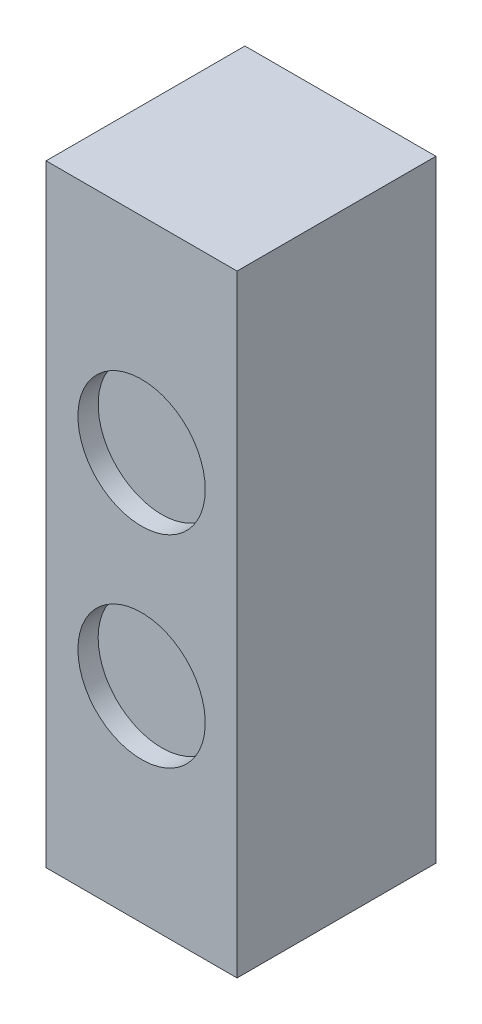
ISO-10303-21;
HEADER;
FILE_DESCRIPTION(('STEP AP214'),'2;1');
FILE_NAME('part.step','',(''),(''),'','','');
FILE_SCHEMA(('AUTOMOTIVE_DESIGN { 1 0 10303 214 1 1 1 1 }'));
ENDSEC;
DATA;
#1=APPLICATION_CONTEXT('core data for automotive mechanical design processes');
#2=APPLICATION_PROTOCOL_DEFINITION('international standard','automotive_design',2000,#1);
#3=PRODUCT_CONTEXT('',#1,'mechanical');
#4=PRODUCT('Part','Part','',(#3));
#5=PRODUCT_RELATED_PRODUCT_CATEGORY('part','',(#4));
#6=PRODUCT_DEFINITION_FORMATION('','',#4);
#7=PRODUCT_DEFINITION_CONTEXT('part definition',#1,'design');
#8=PRODUCT_DEFINITION('design','',#6,#7);
#9=PRODUCT_DEFINITION_SHAPE('','',#8);
#10=(LENGTH_UNIT() NAMED_UNIT(*) SI_UNIT(.MILLI.,.METRE.));
#11=(NAMED_UNIT(*) PLANE_ANGLE_UNIT() SI_UNIT($,.RADIAN.));
#12=(NAMED_UNIT(*) SI_UNIT($,.STERADIAN.) SOLID_ANGLE_UNIT());
#13=UNCERTAINTY_MEASURE_WITH_UNIT(LENGTH_MEASURE(1.E-05),#10,'distance_accuracy_value','');
#14=(GEOMETRIC_REPRESENTATION_CONTEXT(3) GLOBAL_UNCERTAINTY_ASSIGNED_CONTEXT((#13)) GLOBAL_UNIT_ASSIGNED_CONTEXT((#10,
#11,#12)) REPRESENTATION_CONTEXT('',''));
#15=CARTESIAN_POINT('',(0.,0.,0.));
#16=DIRECTION('',(0.,0.,1.));
#17=DIRECTION('',(1.,0.,0.));
#18=AXIS2_PLACEMENT_3D('',#15,#16,#17);
#19=CARTESIAN_POINT('',(0.,0.,24.9936));
#20=DIRECTION('',(1.,0.,0.));
#21=DIRECTION('',(0.,0.,-1.));
#22=AXIS2_PLACEMENT_3D('',#19,#20,#21);
#23=PLANE('',#22);
#24=DIRECTION('',(0.,-1.,0.));
#25=VECTOR('',#24,1.);
#26=CARTESIAN_POINT('',(0.,0.,0.));
#27=LINE('',#26,#25);
#28=CARTESIAN_POINT('',(0.,76.962,0.));
#29=VERTEX_POINT('',#28);
#30=CARTESIAN_POINT('',(0.,0.,0.));
#31=VERTEX_POINT('',#30);
#32=EDGE_CURVE('E107',#29,#31,#27,.T.);
#33=ORIENTED_EDGE('',*,*,#32,.T.);
#34=DIRECTION('',(0.,0.,-1.));
#35=VECTOR('',#34,1.);
#36=CARTESIAN_POINT('',(0.,0.,24.9936));
#37=LINE('',#36,#35);
#38=CARTESIAN_POINT('',(0.,0.,24.9936));
#39=VERTEX_POINT('',#38);
#40=EDGE_CURVE('E11',#39,#31,#37,.T.);
#41=ORIENTED_EDGE('',*,*,#40,.F.);
#42=DIRECTION('',(0.,-1.,0.));
#43=VECTOR('',#42,1.);
#44=CARTESIAN_POINT('',(0.,0.,24.9936));
#45=LINE('',#44,#43);
#46=CARTESIAN_POINT('',(0.,76.962,24.9936));
#47=VERTEX_POINT('',#46);
#48=EDGE_CURVE('E91',#47,#39,#45,.T.);
#49=ORIENTED_EDGE('',*,*,#48,.F.);
#50=DIRECTION('',(0.,0.,-1.));
#51=VECTOR('',#50,1.);
#52=CARTESIAN_POINT('',(0.,76.962,24.9936));
#53=LINE('',#52,#51);
#54=EDGE_CURVE('E103',#47,#29,#53,.T.);
#55=ORIENTED_EDGE('',*,*,#54,.T.);
#56=EDGE_LOOP('',(#33,#41,#49,#55));
#57=FACE_BOUND('',#56,.T.);
#58=ADVANCED_FACE('F39',(#57),#23,.F.);
#59=CARTESIAN_POINT('',(0.,0.,24.9936));
#60=DIRECTION('',(0.,1.,0.));
#61=DIRECTION('',(0.,0.,1.));
#62=AXIS2_PLACEMENT_3D('',#59,#60,#61);
#63=PLANE('',#62);
#64=DIRECTION('',(1.,0.,0.));
#65=VECTOR('',#64,1.);
#66=CARTESIAN_POINT('',(0.,0.,0.));
#67=LINE('',#66,#65);
#68=CARTESIAN_POINT('',(24.003,0.,0.));
#69=VERTEX_POINT('',#68);
#70=EDGE_CURVE('E96',#31,#69,#67,.T.);
#71=ORIENTED_EDGE('',*,*,#70,.T.);
#72=DIRECTION('',(0.,0.,-1.));
#73=VECTOR('',#72,1.);
#74=CARTESIAN_POINT('',(24.003,0.,24.9936));
#75=LINE('',#74,#73);
#76=CARTESIAN_POINT('',(24.003,0.,24.9936));
#77=VERTEX_POINT('',#76);
#78=EDGE_CURVE('E48',#77,#69,#75,.T.);
#79=ORIENTED_EDGE('',*,*,#78,.F.);
#80=DIRECTION('',(1.,0.,0.));
#81=VECTOR('',#80,1.);
#82=CARTESIAN_POINT('',(0.,0.,24.9936));
#83=LINE('',#82,#81);
#84=EDGE_CURVE('E86',#39,#77,#83,.T.);
#85=ORIENTED_EDGE('',*,*,#84,.F.);
#86=ORIENTED_EDGE('',*,*,#40,.T.);
#87=EDGE_LOOP('',(#71,#79,#85,#86));
#88=FACE_BOUND('',#87,.T.);
#89=ADVANCED_FACE('F95',(#88),#63,.F.);
#90=CARTESIAN_POINT('',(24.003,0.,24.9936));
#91=DIRECTION('',(-1.,0.,0.));
#92=DIRECTION('',(0.,0.,1.));
#93=AXIS2_PLACEMENT_3D('',#90,#91,#92);
#94=PLANE('',#93);
#95=DIRECTION('',(0.,1.,0.));
#96=VECTOR('',#95,1.);
#97=CARTESIAN_POINT('',(24.003,0.,0.));
#98=LINE('',#97,#96);
#99=CARTESIAN_POINT('',(24.003,76.962,0.));
#100=VERTEX_POINT('',#99);
#101=EDGE_CURVE('E73',#69,#100,#98,.T.);
#102=ORIENTED_EDGE('',*,*,#101,.T.);
#103=DIRECTION('',(0.,0.,-1.));
#104=VECTOR('',#103,1.);
#105=CARTESIAN_POINT('',(24.003,76.962,24.9936));
#106=LINE('',#105,#104);
#107=CARTESIAN_POINT('',(24.003,76.962,24.9936));
#108=VERTEX_POINT('',#107);
#109=EDGE_CURVE('E98',#108,#100,#106,.T.);
#110=ORIENTED_EDGE('',*,*,#109,.F.);
#111=DIRECTION('',(0.,1.,0.));
#112=VECTOR('',#111,1.);
#113=CARTESIAN_POINT('',(24.003,0.,24.9936));
#114=LINE('',#113,#112);
#115=EDGE_CURVE('E89',#77,#108,#114,.T.);
#116=ORIENTED_EDGE('',*,*,#115,.F.);
#117=ORIENTED_EDGE('',*,*,#78,.T.);
#118=EDGE_LOOP('',(#102,#110,#116,#117));
#119=FACE_BOUND('',#118,.T.);
#120=ADVANCED_FACE('F99',(#119),#94,.F.);
#121=CARTESIAN_POINT('',(0.,76.962,24.9936));
#122=DIRECTION('',(0.,-1.,0.));
#123=DIRECTION('',(0.,0.,-1.));
#124=AXIS2_PLACEMENT_3D('',#121,#122,#123);
#125=PLANE('',#124);
#126=DIRECTION('',(-1.,0.,0.));
#127=VECTOR('',#126,1.);
#128=CARTESIAN_POINT('',(0.,76.962,0.));
#129=LINE('',#128,#127);
#130=EDGE_CURVE('E79',#100,#29,#129,.T.);
#131=ORIENTED_EDGE('',*,*,#130,.T.);
#132=ORIENTED_EDGE('',*,*,#54,.F.);
#133=DIRECTION('',(-1.,0.,0.));
#134=VECTOR('',#133,1.);
#135=CARTESIAN_POINT('',(0.,76.962,24.9936));
#136=LINE('',#135,#134);
#137=EDGE_CURVE('E56',#108,#47,#136,.T.);
#138=ORIENTED_EDGE('',*,*,#137,.F.);
#139=ORIENTED_EDGE('',*,*,#109,.T.);
#140=EDGE_LOOP('',(#131,#132,#138,#139));
#141=FACE_BOUND('',#140,.T.);
#142=ADVANCED_FACE('F121',(#141),#125,.F.);
#143=CARTESIAN_POINT('',(0.,0.,24.9936));
#144=DIRECTION('',(0.,0.,-1.));
#145=DIRECTION('',(-1.,0.,0.));
#146=AXIS2_PLACEMENT_3D('',#143,#144,#145);
#147=PLANE('',#146);
#148=CARTESIAN_POINT('',(12.0015,51.181,24.9936));
#149=DIRECTION('',(0.,0.,1.));
#150=DIRECTION('',(1.,0.,0.));
#151=AXIS2_PLACEMENT_3D('',#148,#149,#150);
#152=CIRCLE('',#151,8.001);
#153=CARTESIAN_POINT('',(20.0025,51.181,24.9936));
#154=VERTEX_POINT('',#153);
#155=EDGE_CURVE('E136',#154,#154,#152,.T.);
#156=ORIENTED_EDGE('',*,*,#155,.F.);
#157=EDGE_LOOP('',(#156));
#158=FACE_BOUND('',#157,.T.);
#159=CARTESIAN_POINT('',(12.0015,25.781,24.9936));
#160=DIRECTION('',(0.,0.,1.));
#161=DIRECTION('',(-1.,0.,0.));
#162=AXIS2_PLACEMENT_3D('',#159,#160,#161);
#163=CIRCLE('',#162,8.001);
#164=CARTESIAN_POINT('',(4.0005,25.781,24.9936));
#165=VERTEX_POINT('',#164);
#166=EDGE_CURVE('E128',#165,#165,#163,.T.);
#167=ORIENTED_EDGE('',*,*,#166,.F.);
#168=EDGE_LOOP('',(#167));
#169=FACE_BOUND('',#168,.T.);
#170=ORIENTED_EDGE('',*,*,#48,.T.);
#171=ORIENTED_EDGE('',*,*,#84,.T.);
#172=ORIENTED_EDGE('',*,*,#115,.T.);
#173=ORIENTED_EDGE('',*,*,#137,.T.);
#174=EDGE_LOOP('',(#170,#171,#172,#173));
#175=FACE_BOUND('',#174,.T.);
#176=ADVANCED_FACE('F87',(#158,#169,#175),#147,.F.);
#177=CARTESIAN_POINT('',(0.,0.,0.));
#178=DIRECTION('',(0.,0.,-1.));
#179=DIRECTION('',(-1.,0.,0.));
#180=AXIS2_PLACEMENT_3D('',#177,#178,#179);
#181=PLANE('',#180);
#182=ORIENTED_EDGE('',*,*,#32,.F.);
#183=ORIENTED_EDGE('',*,*,#130,.F.);
#184=ORIENTED_EDGE('',*,*,#101,.F.);
#185=ORIENTED_EDGE('',*,*,#70,.F.);
#186=EDGE_LOOP('',(#182,#183,#184,#185));
#187=FACE_BOUND('',#186,.T.);
#188=ADVANCED_FACE('F124',(#187),#181,.T.);
#189=CARTESIAN_POINT('',(12.0015,25.781,22.4536));
#190=DIRECTION('',(0.,0.,1.));
#191=DIRECTION('',(1.,0.,0.));
#192=AXIS2_PLACEMENT_3D('',#189,#190,#191);
#193=CYLINDRICAL_SURFACE('',#192,8.001);
#194=CARTESIAN_POINT('',(12.0015,25.781,22.4536));
#195=DIRECTION('',(0.,0.,1.));
#196=DIRECTION('',(-1.,0.,0.));
#197=AXIS2_PLACEMENT_3D('',#194,#195,#196);
#198=CIRCLE('',#197,8.001);
#199=CARTESIAN_POINT('',(4.0005,25.781,22.4536));
#200=VERTEX_POINT('',#199);
#201=EDGE_CURVE('E132',#200,#200,#198,.T.);
#202=ORIENTED_EDGE('',*,*,#201,.F.);
#203=EDGE_LOOP('',(#202));
#204=FACE_BOUND('',#203,.T.);
#205=ORIENTED_EDGE('',*,*,#166,.T.);
#206=EDGE_LOOP('',(#205));
#207=FACE_BOUND('',#206,.T.);
#208=ADVANCED_FACE('F158',(#204,#207),#193,.F.);
#209=CARTESIAN_POINT('',(12.0015,25.781,22.4536));
#210=DIRECTION('',(0.,0.,-1.));
#211=DIRECTION('',(-1.,0.,0.));
#212=AXIS2_PLACEMENT_3D('',#209,#210,#211);
#213=PLANE('',#212);
#214=ORIENTED_EDGE('',*,*,#201,.T.);
#215=EDGE_LOOP('',(#214));
#216=FACE_BOUND('',#215,.T.);
#217=ADVANCED_FACE('F149',(#216),#213,.F.);
#218=CARTESIAN_POINT('',(12.0015,51.181,22.4536));
#219=DIRECTION('',(0.,0.,1.));
#220=DIRECTION('',(1.,0.,0.));
#221=AXIS2_PLACEMENT_3D('',#218,#219,#220);
#222=CYLINDRICAL_SURFACE('',#221,8.001);
#223=CARTESIAN_POINT('',(12.0015,51.181,22.4536));
#224=DIRECTION('',(0.,0.,1.));
#225=DIRECTION('',(1.,0.,0.));
#226=AXIS2_PLACEMENT_3D('',#223,#224,#225);
#227=CIRCLE('',#226,8.001);
#228=CARTESIAN_POINT('',(20.0025,51.181,22.4536));
#229=VERTEX_POINT('',#228);
#230=EDGE_CURVE('E111',#229,#229,#227,.T.);
#231=ORIENTED_EDGE('',*,*,#230,.F.);
#232=EDGE_LOOP('',(#231));
#233=FACE_BOUND('',#232,.T.);
#234=ORIENTED_EDGE('',*,*,#155,.T.);
#235=EDGE_LOOP('',(#234));
#236=FACE_BOUND('',#235,.T.);
#237=ADVANCED_FACE('F146',(#233,#236),#222,.F.);
#238=CARTESIAN_POINT('',(12.0015,51.181,22.4536));
#239=DIRECTION('',(0.,0.,1.));
#240=DIRECTION('',(1.,0.,0.));
#241=AXIS2_PLACEMENT_3D('',#238,#239,#240);
#242=PLANE('',#241);
#243=ORIENTED_EDGE('',*,*,#230,.T.);
#244=EDGE_LOOP('',(#243));
#245=FACE_BOUND('',#244,.T.);
#246=ADVANCED_FACE('F144',(#245),#242,.T.);
#247=CLOSED_SHELL('',(#58,#89,#120,#142,#176,#188,#208,#217,#237,#246));
#248=MANIFOLD_SOLID_BREP('B2',#247);
#249=ADVANCED_BREP_SHAPE_REPRESENTATION('',(#18,#248),#14);
#250=SHAPE_DEFINITION_REPRESENTATION(#9,#249);
ENDSEC;
END-ISO-10303-21;
